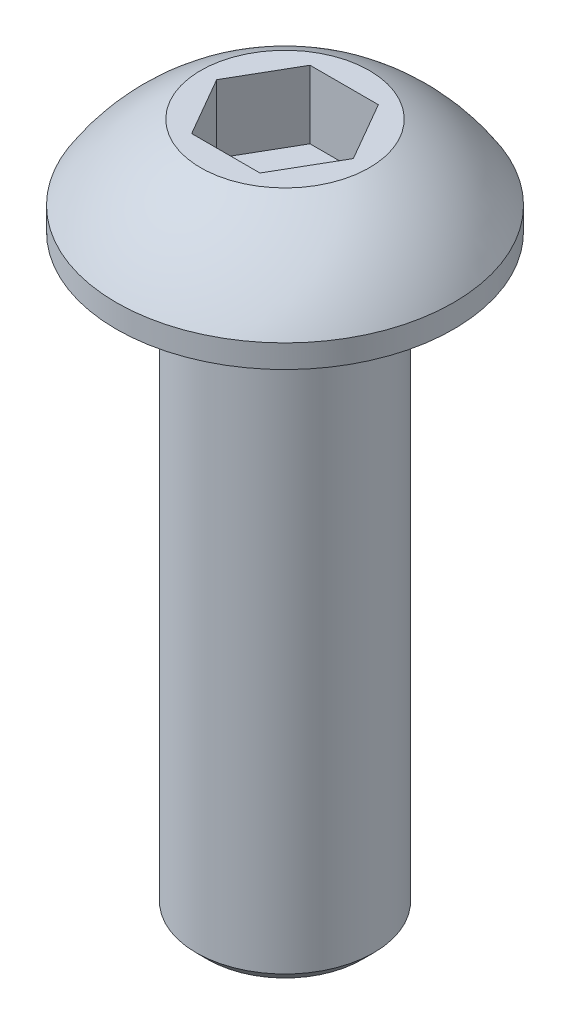
ISO-10303-21;
HEADER;
FILE_DESCRIPTION(('STEP AP214'),'2;1');
FILE_NAME('part.step','',(''),(''),'','','');
FILE_SCHEMA(('AUTOMOTIVE_DESIGN { 1 0 10303 214 1 1 1 1 }'));
ENDSEC;
DATA;
#1=APPLICATION_CONTEXT('core data for automotive mechanical design processes');
#2=APPLICATION_PROTOCOL_DEFINITION('international standard','automotive_design',2000,#1);
#3=PRODUCT_CONTEXT('',#1,'mechanical');
#4=PRODUCT('Part','Part','',(#3));
#5=PRODUCT_RELATED_PRODUCT_CATEGORY('part','',(#4));
#6=PRODUCT_DEFINITION_FORMATION('','',#4);
#7=PRODUCT_DEFINITION_CONTEXT('part definition',#1,'design');
#8=PRODUCT_DEFINITION('design','',#6,#7);
#9=PRODUCT_DEFINITION_SHAPE('','',#8);
#10=(LENGTH_UNIT() NAMED_UNIT(*) SI_UNIT(.MILLI.,.METRE.));
#11=(NAMED_UNIT(*) PLANE_ANGLE_UNIT() SI_UNIT($,.RADIAN.));
#12=(NAMED_UNIT(*) SI_UNIT($,.STERADIAN.) SOLID_ANGLE_UNIT());
#13=UNCERTAINTY_MEASURE_WITH_UNIT(LENGTH_MEASURE(1.E-05),#10,'distance_accuracy_value','');
#14=(GEOMETRIC_REPRESENTATION_CONTEXT(3) GLOBAL_UNCERTAINTY_ASSIGNED_CONTEXT((#13)) GLOBAL_UNIT_ASSIGNED_CONTEXT((#10,
#11,#12)) REPRESENTATION_CONTEXT('',''));
#15=CARTESIAN_POINT('',(0.,0.,0.));
#16=DIRECTION('',(0.,0.,1.));
#17=DIRECTION('',(1.,0.,0.));
#18=AXIS2_PLACEMENT_3D('',#15,#16,#17);
#19=CARTESIAN_POINT('',(0.,1.65,0.));
#20=DIRECTION('',(0.,-1.,0.));
#21=DIRECTION('',(0.,0.,-1.));
#22=AXIS2_PLACEMENT_3D('',#19,#20,#21);
#23=PLANE('',#22);
#24=DIRECTION('',(0.5,0.,-0.866025403784439));
#25=VECTOR('',#24,1.);
#26=CARTESIAN_POINT('',(0.577350269189626,1.65,1.));
#27=LINE('',#26,#25);
#28=CARTESIAN_POINT('',(0.577350269189626,1.65,1.));
#29=VERTEX_POINT('',#28);
#30=CARTESIAN_POINT('',(1.15470053837925,1.65,0.));
#31=VERTEX_POINT('',#30);
#32=EDGE_CURVE('E122',#29,#31,#27,.T.);
#33=ORIENTED_EDGE('',*,*,#32,.F.);
#34=DIRECTION('',(1.,0.,0.));
#35=VECTOR('',#34,1.);
#36=CARTESIAN_POINT('',(-0.577350269189626,1.65,1.));
#37=LINE('',#36,#35);
#38=CARTESIAN_POINT('',(-0.577350269189626,1.65,1.));
#39=VERTEX_POINT('',#38);
#40=EDGE_CURVE('E48',#39,#29,#37,.T.);
#41=ORIENTED_EDGE('',*,*,#40,.F.);
#42=DIRECTION('',(0.5,0.,0.866025403784439));
#43=VECTOR('',#42,1.);
#44=CARTESIAN_POINT('',(-1.15470053837925,1.65,0.));
#45=LINE('',#44,#43);
#46=CARTESIAN_POINT('',(-1.15470053837925,1.65,0.));
#47=VERTEX_POINT('',#46);
#48=EDGE_CURVE('E131',#47,#39,#45,.T.);
#49=ORIENTED_EDGE('',*,*,#48,.F.);
#50=DIRECTION('',(-0.5,0.,0.866025403784438));
#51=VECTOR('',#50,1.);
#52=CARTESIAN_POINT('',(-0.577350269189626,1.65,-1.));
#53=LINE('',#52,#51);
#54=CARTESIAN_POINT('',(-0.577350269189626,1.65,-1.));
#55=VERTEX_POINT('',#54);
#56=EDGE_CURVE('E129',#55,#47,#53,.T.);
#57=ORIENTED_EDGE('',*,*,#56,.F.);
#58=DIRECTION('',(-1.,0.,0.));
#59=VECTOR('',#58,1.);
#60=CARTESIAN_POINT('',(0.577350269189625,1.65,-1.));
#61=LINE('',#60,#59);
#62=CARTESIAN_POINT('',(0.577350269189625,1.65,-1.));
#63=VERTEX_POINT('',#62);
#64=EDGE_CURVE('E96',#63,#55,#61,.T.);
#65=ORIENTED_EDGE('',*,*,#64,.F.);
#66=DIRECTION('',(-0.5,0.,-0.866025403784439));
#67=VECTOR('',#66,1.);
#68=CARTESIAN_POINT('',(1.15470053837925,1.65,0.));
#69=LINE('',#68,#67);
#70=EDGE_CURVE('E125',#31,#63,#69,.T.);
#71=ORIENTED_EDGE('',*,*,#70,.F.);
#72=EDGE_LOOP('',(#33,#41,#49,#57,#65,#71));
#73=FACE_BOUND('',#72,.T.);
#74=CARTESIAN_POINT('',(0.,1.65,0.));
#75=DIRECTION('',(0.,1.,0.));
#76=DIRECTION('',(0.,0.,1.));
#77=AXIS2_PLACEMENT_3D('',#74,#75,#76);
#78=CIRCLE('',#77,1.425);
#79=CARTESIAN_POINT('',(0.,1.65,-1.425));
#80=VERTEX_POINT('',#79);
#81=EDGE_CURVE('E11',#80,#80,#78,.T.);
#82=ORIENTED_EDGE('',*,*,#81,.T.);
#83=EDGE_LOOP('',(#82));
#84=FACE_BOUND('',#83,.T.);
#85=ADVANCED_FACE('F34',(#73,#84),#23,.F.);
#86=CARTESIAN_POINT('',(0.,-1.39741071428571,0.));
#87=DIRECTION('',(0.,1.,0.));
#88=DIRECTION('',(0.,0.,-1.));
#89=AXIS2_PLACEMENT_3D('',#86,#87,#88);
#90=SPHERICAL_SURFACE('',#89,3.36412500682471);
#91=CARTESIAN_POINT('',(0.,0.39,0.));
#92=DIRECTION('',(0.,1.,0.));
#93=DIRECTION('',(0.,0.,1.));
#94=AXIS2_PLACEMENT_3D('',#91,#92,#93);
#95=CIRCLE('',#94,2.85);
#96=CARTESIAN_POINT('',(0.,0.39,-2.85));
#97=VERTEX_POINT('',#96);
#98=EDGE_CURVE('E41',#97,#97,#95,.T.);
#99=CARTESIAN_POINT('',(0.,1.65,-1.425));
#100=CARTESIAN_POINT('',(0.,1.64149095049913,-1.44319693920159));
#101=CARTESIAN_POINT('',(0.,1.63281887604925,-1.46131764558181));
#102=CARTESIAN_POINT('',(0.,1.61515154188376,-1.49740081787377));
#103=CARTESIAN_POINT('',(0.,1.60615628216816,-1.51536328378551));
#104=CARTESIAN_POINT('',(0.,1.58784544210356,-1.55112420031471));
#105=CARTESIAN_POINT('',(0.,1.57852986175455,-1.56892265093218));
#106=CARTESIAN_POINT('',(0.,1.55958137563401,-1.6043498282852));
#107=CARTESIAN_POINT('',(0.,1.54994846986247,-1.62197855502074));
#108=CARTESIAN_POINT('',(0.,1.53036842249044,-1.65706062684029));
#109=CARTESIAN_POINT('',(0.,1.52042128088994,-1.6745139719243));
#110=CARTESIAN_POINT('',(0.,1.50021595428592,-1.70923967992745));
#111=CARTESIAN_POINT('',(0.,1.48995776928239,-1.72651204284659));
#112=CARTESIAN_POINT('',(0.,1.46913364757643,-1.76087024382148));
#113=CARTESIAN_POINT('',(0.,1.45856771087399,-1.77795608187723));
#114=CARTESIAN_POINT('',(0.,1.43713147637405,-1.81193575035214));
#115=CARTESIAN_POINT('',(0.,1.42626117857655,-1.8288295807713));
#116=CARTESIAN_POINT('',(0.,1.40421971012039,-1.86241981279568));
#117=CARTESIAN_POINT('',(0.,1.39304853946175,-1.87911621440089));
#118=CARTESIAN_POINT('',(0.,1.37040891007659,-1.91230623097925));
#119=CARTESIAN_POINT('',(0.,1.35894045135009,-1.92879984595241));
#120=CARTESIAN_POINT('',(0.,1.33570992601851,-1.96157899652078));
#121=CARTESIAN_POINT('',(0.,1.32394785941343,-1.97786453211599));
#122=CARTESIAN_POINT('',(0.,1.3001338927325,-2.0102222979549));
#123=CARTESIAN_POINT('',(0.,1.28808199265664,-2.0262945281986));
#124=CARTESIAN_POINT('',(0.,1.26369222644834,-2.05822052580979));
#125=CARTESIAN_POINT('',(0.,1.2513543603159,-2.07407429317729));
#126=CARTESIAN_POINT('',(0.,1.2263966211742,-2.10555827761544));
#127=CARTESIAN_POINT('',(0.,1.21377674816496,-2.12118849468608));
#128=CARTESIAN_POINT('',(0.,1.18825904494449,-2.15222036284638));
#129=CARTESIAN_POINT('',(0.,1.17536121473327,-2.16762201393603));
#130=CARTESIAN_POINT('',(0.,1.14929173597923,-2.19819180779629));
#131=CARTESIAN_POINT('',(0.,1.1361200874364,-2.21335995056689));
#132=CARTESIAN_POINT('',(0.,1.1095071987569,-2.24345786038299));
#133=CARTESIAN_POINT('',(0.,1.09606595862022,-2.25838762742849));
#134=CARTESIAN_POINT('',(0.,1.06891820000179,-2.28800399488234));
#135=CARTESIAN_POINT('',(0.,1.05521168152004,-2.30269059529069));
#136=CARTESIAN_POINT('',(0.,1.02753776458719,-2.33181591658951));
#137=CARTESIAN_POINT('',(0.,1.01357036613608,-2.34625463747998));
#138=CARTESIAN_POINT('',(0.,0.985379171355736,-2.37487956640605));
#139=CARTESIAN_POINT('',(0.,0.971155375026495,-2.38906577444164));
#140=CARTESIAN_POINT('',(0.,0.942455948858309,-2.41718112535147));
#141=CARTESIAN_POINT('',(0.,0.927980319019364,-2.4311102682257));
#142=CARTESIAN_POINT('',(0.,0.898781871012759,-2.4587070189977));
#143=CARTESIAN_POINT('',(0.,0.884059052845099,-2.47237462689547));
#144=CARTESIAN_POINT('',(0.,0.854370952683837,-2.49944392182496));
#145=CARTESIAN_POINT('',(0.,0.839405670690235,-2.51284560885668));
#146=CARTESIAN_POINT('',(0.,0.809237445186139,-2.5393787614983));
#147=CARTESIAN_POINT('',(0.,0.794034501675645,-2.55251022710819));
#148=CARTESIAN_POINT('',(0.,0.763395831709919,-2.57849872306094));
#149=CARTESIAN_POINT('',(0.,0.747960105254686,-2.5913557534038));
#150=CARTESIAN_POINT('',(0.,0.71686082267716,-2.61679125305221));
#151=CARTESIAN_POINT('',(0.,0.701197266554865,-2.62936972235777));
#152=CARTESIAN_POINT('',(0.,0.669647351007315,-2.65424406351484));
#153=CARTESIAN_POINT('',(0.,0.653760991582058,-2.66653993536634));
#154=CARTESIAN_POINT('',(0.,0.621770567376661,-2.6908451360167));
#155=CARTESIAN_POINT('',(0.,0.60566650259652,-2.70285446481555));
#156=CARTESIAN_POINT('',(0.,0.573245835165109,-2.72658272521418));
#157=CARTESIAN_POINT('',(0.,0.556929232513839,-2.73830165681396));
#158=CARTESIAN_POINT('',(0.,0.524088726240428,-2.76144536371601));
#159=CARTESIAN_POINT('',(0.,0.507564822618288,-2.77287013901829));
#160=CARTESIAN_POINT('',(0.,0.474315013295553,-2.79542186167715));
#161=CARTESIAN_POINT('',(0.,0.457589107594958,-2.80654880903373));
#162=CARTESIAN_POINT('',(0.,0.423940674735817,-2.82850132563867));
#163=CARTESIAN_POINT('',(0.,0.407018147577271,-2.83932689488702));
#164=CARTESIAN_POINT('',(0.,0.39,-2.85));
#165=B_SPLINE_CURVE_WITH_KNOTS('',3,(#99,#100,#101,#102,#103,#104,#105,#106,#107,#108,#109,#110,
#111,#112,#113,#114,#115,#116,#117,#118,#119,#120,#121,#122,#123,#124,#125,#126,#127,#128,#129,
#130,#131,#132,#133,#134,#135,#136,#137,#138,#139,#140,#141,#142,#143,#144,#145,#146,#147,#148,
#149,#150,#151,#152,#153,#154,#155,#156,#157,#158,#159,#160,#161,#162,#163,#164),.UNSPECIFIED.,
.F.,.F.,(4,2,2,2,2,2,2,2,2,2,2,2,2,2,2,2,2,2,2,2,2,2,2,2,2,2,2,2,2,2,2,2,4),(0.,
0.0602635497340825,0.120527099468164,0.180790649202247,0.24105419893633,0.301317748670412,
0.361581298404494,0.421844848138577,0.482108397872659,0.542371947606741,0.602635497340824,
0.662899047074906,0.723162596808989,0.783426146543071,0.843689696277154,0.903953246011236,
0.964216795745318,1.0244803454794,1.08474389521348,1.14500744494757,1.20527099468165,
1.26553454441573,1.32579809414981,1.3860616438839,1.44632519361798,1.50658874335206,
1.56685229308614,1.62711584282022,1.68737939255431,1.74764294228839,1.80790649202247,
1.86817004175655,1.92843359149064),.UNSPECIFIED.);
#166=EDGE_CURVE('BSEAM157',#80,#97,#165,.T.);
#167=ORIENTED_EDGE('',*,*,#81,.F.);
#168=ORIENTED_EDGE('',*,*,#98,.T.);
#169=ORIENTED_EDGE('',*,*,#166,.T.);
#170=ORIENTED_EDGE('',*,*,#166,.F.);
#171=EDGE_LOOP('',(#167,#169,#168,#170));
#172=FACE_BOUND('',#171,.T.);
#173=ADVANCED_FACE('F157',(#172),#90,.T.);
#174=CARTESIAN_POINT('',(0.,10.4570624946846,0.));
#175=DIRECTION('',(0.,1.,0.));
#176=DIRECTION('',(0.,0.,1.));
#177=AXIS2_PLACEMENT_3D('',#174,#175,#176);
#178=CYLINDRICAL_SURFACE('',#177,2.85);
#179=ORIENTED_EDGE('',*,*,#98,.F.);
#180=EDGE_LOOP('',(#179));
#181=FACE_BOUND('',#180,.T.);
#182=CARTESIAN_POINT('',(0.,0.,0.));
#183=DIRECTION('',(0.,1.,0.));
#184=DIRECTION('',(0.,0.,1.));
#185=AXIS2_PLACEMENT_3D('',#182,#183,#184);
#186=CIRCLE('',#185,2.85);
#187=CARTESIAN_POINT('',(0.,0.,2.85));
#188=VERTEX_POINT('',#187);
#189=EDGE_CURVE('E152',#188,#188,#186,.T.);
#190=ORIENTED_EDGE('',*,*,#189,.T.);
#191=EDGE_LOOP('',(#190));
#192=FACE_BOUND('',#191,.T.);
#193=ADVANCED_FACE('F159',(#181,#192),#178,.T.);
#194=CARTESIAN_POINT('',(0.,0.,-1.7));
#195=DIRECTION('',(0.,1.,0.));
#196=DIRECTION('',(0.,0.,1.));
#197=AXIS2_PLACEMENT_3D('',#194,#195,#196);
#198=PLANE('',#197);
#199=ORIENTED_EDGE('',*,*,#189,.F.);
#200=EDGE_LOOP('',(#199));
#201=FACE_BOUND('',#200,.T.);
#202=CARTESIAN_POINT('',(0.,0.,0.));
#203=DIRECTION('',(0.,1.,0.));
#204=DIRECTION('',(0.,0.,1.));
#205=AXIS2_PLACEMENT_3D('',#202,#203,#204);
#206=CIRCLE('',#205,1.7);
#207=CARTESIAN_POINT('',(0.,0.,1.7));
#208=VERTEX_POINT('',#207);
#209=EDGE_CURVE('E149',#208,#208,#206,.T.);
#210=ORIENTED_EDGE('',*,*,#209,.T.);
#211=EDGE_LOOP('',(#210));
#212=FACE_BOUND('',#211,.T.);
#213=ADVANCED_FACE('F162',(#201,#212),#198,.F.);
#214=CARTESIAN_POINT('',(0.,-0.2,0.));
#215=DIRECTION('',(0.,1.,0.));
#216=DIRECTION('',(0.,0.,1.));
#217=AXIS2_PLACEMENT_3D('',#214,#215,#216);
#218=TOROIDAL_SURFACE('',#217,1.7,0.2);
#219=ORIENTED_EDGE('',*,*,#209,.F.);
#220=EDGE_LOOP('',(#219));
#221=FACE_BOUND('',#220,.T.);
#222=CARTESIAN_POINT('',(0.,-0.200000000000002,0.));
#223=DIRECTION('',(0.,1.,0.));
#224=DIRECTION('',(0.,0.,1.));
#225=AXIS2_PLACEMENT_3D('',#222,#223,#224);
#226=CIRCLE('',#225,1.5);
#227=CARTESIAN_POINT('',(0.,-0.200000000000002,1.5));
#228=VERTEX_POINT('',#227);
#229=EDGE_CURVE('E146',#228,#228,#226,.T.);
#230=ORIENTED_EDGE('',*,*,#229,.T.);
#231=EDGE_LOOP('',(#230));
#232=FACE_BOUND('',#231,.T.);
#233=ADVANCED_FACE('F168',(#221,#232),#218,.F.);
#234=CARTESIAN_POINT('',(0.,10.4570624946846,0.));
#235=DIRECTION('',(0.,1.,0.));
#236=DIRECTION('',(0.,0.,1.));
#237=AXIS2_PLACEMENT_3D('',#234,#235,#236);
#238=CYLINDRICAL_SURFACE('',#237,1.5);
#239=ORIENTED_EDGE('',*,*,#229,.F.);
#240=EDGE_LOOP('',(#239));
#241=FACE_BOUND('',#240,.T.);
#242=CARTESIAN_POINT('',(0.,-9.8,0.));
#243=DIRECTION('',(0.,1.,0.));
#244=DIRECTION('',(0.,0.,1.));
#245=AXIS2_PLACEMENT_3D('',#242,#243,#244);
#246=CIRCLE('',#245,1.5);
#247=CARTESIAN_POINT('',(0.,-9.8,1.5));
#248=VERTEX_POINT('',#247);
#249=EDGE_CURVE('E143',#248,#248,#246,.T.);
#250=ORIENTED_EDGE('',*,*,#249,.T.);
#251=EDGE_LOOP('',(#250));
#252=FACE_BOUND('',#251,.T.);
#253=ADVANCED_FACE('F174',(#241,#252),#238,.T.);
#254=CARTESIAN_POINT('',(0.,-10.,0.));
#255=DIRECTION('',(0.,1.,0.));
#256=DIRECTION('',(0.,0.,1.));
#257=AXIS2_PLACEMENT_3D('',#254,#255,#256);
#258=CONICAL_SURFACE('',#257,1.3,0.785398163397443);
#259=ORIENTED_EDGE('',*,*,#249,.F.);
#260=EDGE_LOOP('',(#259));
#261=FACE_BOUND('',#260,.T.);
#262=CARTESIAN_POINT('',(0.,-10.,0.));
#263=DIRECTION('',(0.,1.,0.));
#264=DIRECTION('',(0.,0.,1.));
#265=AXIS2_PLACEMENT_3D('',#262,#263,#264);
#266=CIRCLE('',#265,1.3);
#267=CARTESIAN_POINT('',(0.,-10.,1.3));
#268=VERTEX_POINT('',#267);
#269=EDGE_CURVE('E135',#268,#268,#266,.T.);
#270=ORIENTED_EDGE('',*,*,#269,.T.);
#271=EDGE_LOOP('',(#270));
#272=FACE_BOUND('',#271,.T.);
#273=ADVANCED_FACE('F180',(#261,#272),#258,.T.);
#274=CARTESIAN_POINT('',(0.,-10.,0.));
#275=DIRECTION('',(0.,1.,0.));
#276=DIRECTION('',(0.,0.,1.));
#277=AXIS2_PLACEMENT_3D('',#274,#275,#276);
#278=PLANE('',#277);
#279=ORIENTED_EDGE('',*,*,#269,.F.);
#280=EDGE_LOOP('',(#279));
#281=FACE_BOUND('',#280,.T.);
#282=ADVANCED_FACE('F186',(#281),#278,.F.);
#283=CARTESIAN_POINT('',(-0.577350269189626,0.5,1.));
#284=DIRECTION('',(0.,0.,1.));
#285=DIRECTION('',(1.,0.,0.));
#286=AXIS2_PLACEMENT_3D('',#283,#284,#285);
#287=PLANE('',#286);
#288=ORIENTED_EDGE('',*,*,#40,.T.);
#289=DIRECTION('',(0.,1.,0.));
#290=VECTOR('',#289,1.);
#291=CARTESIAN_POINT('',(0.577350269189626,0.5,1.));
#292=LINE('',#291,#290);
#293=CARTESIAN_POINT('',(0.577350269189626,0.5,1.));
#294=VERTEX_POINT('',#293);
#295=EDGE_CURVE('E78',#294,#29,#292,.T.);
#296=ORIENTED_EDGE('',*,*,#295,.F.);
#297=DIRECTION('',(1.,0.,0.));
#298=VECTOR('',#297,1.);
#299=CARTESIAN_POINT('',(-0.577350269189626,0.5,1.));
#300=LINE('',#299,#298);
#301=CARTESIAN_POINT('',(-0.577350269189626,0.5,1.));
#302=VERTEX_POINT('',#301);
#303=EDGE_CURVE('E133',#302,#294,#300,.T.);
#304=ORIENTED_EDGE('',*,*,#303,.F.);
#305=DIRECTION('',(0.,1.,0.));
#306=VECTOR('',#305,1.);
#307=CARTESIAN_POINT('',(-0.577350269189626,0.5,1.));
#308=LINE('',#307,#306);
#309=EDGE_CURVE('E56',#302,#39,#308,.T.);
#310=ORIENTED_EDGE('',*,*,#309,.T.);
#311=EDGE_LOOP('',(#288,#296,#304,#310));
#312=FACE_BOUND('',#311,.T.);
#313=ADVANCED_FACE('F191',(#312),#287,.F.);
#314=CARTESIAN_POINT('',(-1.15470053837925,0.5,0.));
#315=DIRECTION('',(-0.866025403784439,0.,0.5));
#316=DIRECTION('',(0.5,0.,0.866025403784439));
#317=AXIS2_PLACEMENT_3D('',#314,#315,#316);
#318=PLANE('',#317);
#319=ORIENTED_EDGE('',*,*,#48,.T.);
#320=ORIENTED_EDGE('',*,*,#309,.F.);
#321=DIRECTION('',(0.5,0.,0.866025403784439));
#322=VECTOR('',#321,1.);
#323=CARTESIAN_POINT('',(-1.15470053837925,0.5,0.));
#324=LINE('',#323,#322);
#325=CARTESIAN_POINT('',(-1.15470053837925,0.5,0.));
#326=VERTEX_POINT('',#325);
#327=EDGE_CURVE('E108',#326,#302,#324,.T.);
#328=ORIENTED_EDGE('',*,*,#327,.F.);
#329=DIRECTION('',(0.,1.,0.));
#330=VECTOR('',#329,1.);
#331=CARTESIAN_POINT('',(-1.15470053837925,0.5,0.));
#332=LINE('',#331,#330);
#333=EDGE_CURVE('E100',#326,#47,#332,.T.);
#334=ORIENTED_EDGE('',*,*,#333,.T.);
#335=EDGE_LOOP('',(#319,#320,#328,#334));
#336=FACE_BOUND('',#335,.T.);
#337=ADVANCED_FACE('F196',(#336),#318,.F.);
#338=CARTESIAN_POINT('',(-0.577350269189626,0.5,-1.));
#339=DIRECTION('',(-0.866025403784438,0.,-0.5));
#340=DIRECTION('',(-0.5,0.,0.866025403784438));
#341=AXIS2_PLACEMENT_3D('',#338,#339,#340);
#342=PLANE('',#341);
#343=ORIENTED_EDGE('',*,*,#56,.T.);
#344=ORIENTED_EDGE('',*,*,#333,.F.);
#345=DIRECTION('',(-0.5,0.,0.866025403784438));
#346=VECTOR('',#345,1.);
#347=CARTESIAN_POINT('',(-0.577350269189626,0.5,-1.));
#348=LINE('',#347,#346);
#349=CARTESIAN_POINT('',(-0.577350269189626,0.5,-1.));
#350=VERTEX_POINT('',#349);
#351=EDGE_CURVE('E104',#350,#326,#348,.T.);
#352=ORIENTED_EDGE('',*,*,#351,.F.);
#353=DIRECTION('',(0.,1.,0.));
#354=VECTOR('',#353,1.);
#355=CARTESIAN_POINT('',(-0.577350269189626,0.5,-1.));
#356=LINE('',#355,#354);
#357=EDGE_CURVE('E89',#350,#55,#356,.T.);
#358=ORIENTED_EDGE('',*,*,#357,.T.);
#359=EDGE_LOOP('',(#343,#344,#352,#358));
#360=FACE_BOUND('',#359,.T.);
#361=ADVANCED_FACE('F105',(#360),#342,.F.);
#362=CARTESIAN_POINT('',(0.577350269189625,0.5,-1.));
#363=DIRECTION('',(0.,0.,-1.));
#364=DIRECTION('',(-1.,0.,0.));
#365=AXIS2_PLACEMENT_3D('',#362,#363,#364);
#366=PLANE('',#365);
#367=ORIENTED_EDGE('',*,*,#64,.T.);
#368=ORIENTED_EDGE('',*,*,#357,.F.);
#369=DIRECTION('',(-1.,0.,0.));
#370=VECTOR('',#369,1.);
#371=CARTESIAN_POINT('',(0.577350269189625,0.5,-1.));
#372=LINE('',#371,#370);
#373=CARTESIAN_POINT('',(0.577350269189625,0.5,-1.));
#374=VERTEX_POINT('',#373);
#375=EDGE_CURVE('E93',#374,#350,#372,.T.);
#376=ORIENTED_EDGE('',*,*,#375,.F.);
#377=DIRECTION('',(0.,1.,0.));
#378=VECTOR('',#377,1.);
#379=CARTESIAN_POINT('',(0.577350269189625,0.5,-1.));
#380=LINE('',#379,#378);
#381=EDGE_CURVE('E101',#374,#63,#380,.T.);
#382=ORIENTED_EDGE('',*,*,#381,.T.);
#383=EDGE_LOOP('',(#367,#368,#376,#382));
#384=FACE_BOUND('',#383,.T.);
#385=ADVANCED_FACE('F91',(#384),#366,.F.);
#386=CARTESIAN_POINT('',(1.15470053837925,0.5,0.));
#387=DIRECTION('',(0.866025403784439,0.,-0.5));
#388=DIRECTION('',(-0.5,0.,-0.866025403784439));
#389=AXIS2_PLACEMENT_3D('',#386,#387,#388);
#390=PLANE('',#389);
#391=ORIENTED_EDGE('',*,*,#70,.T.);
#392=ORIENTED_EDGE('',*,*,#381,.F.);
#393=DIRECTION('',(-0.5,0.,-0.866025403784439));
#394=VECTOR('',#393,1.);
#395=CARTESIAN_POINT('',(1.15470053837925,0.5,0.));
#396=LINE('',#395,#394);
#397=CARTESIAN_POINT('',(1.15470053837925,0.5,0.));
#398=VERTEX_POINT('',#397);
#399=EDGE_CURVE('E114',#398,#374,#396,.T.);
#400=ORIENTED_EDGE('',*,*,#399,.F.);
#401=DIRECTION('',(0.,1.,0.));
#402=VECTOR('',#401,1.);
#403=CARTESIAN_POINT('',(1.15470053837925,0.5,0.));
#404=LINE('',#403,#402);
#405=EDGE_CURVE('E138',#398,#31,#404,.T.);
#406=ORIENTED_EDGE('',*,*,#405,.T.);
#407=EDGE_LOOP('',(#391,#392,#400,#406));
#408=FACE_BOUND('',#407,.T.);
#409=ADVANCED_FACE('F222',(#408),#390,.F.);
#410=CARTESIAN_POINT('',(0.577350269189626,0.5,1.));
#411=DIRECTION('',(0.866025403784438,0.,0.5));
#412=DIRECTION('',(0.5,0.,-0.866025403784439));
#413=AXIS2_PLACEMENT_3D('',#410,#411,#412);
#414=PLANE('',#413);
#415=ORIENTED_EDGE('',*,*,#32,.T.);
#416=ORIENTED_EDGE('',*,*,#405,.F.);
#417=DIRECTION('',(0.5,0.,-0.866025403784439));
#418=VECTOR('',#417,1.);
#419=CARTESIAN_POINT('',(0.577350269189626,0.5,1.));
#420=LINE('',#419,#418);
#421=EDGE_CURVE('E116',#294,#398,#420,.T.);
#422=ORIENTED_EDGE('',*,*,#421,.F.);
#423=ORIENTED_EDGE('',*,*,#295,.T.);
#424=EDGE_LOOP('',(#415,#416,#422,#423));
#425=FACE_BOUND('',#424,.T.);
#426=ADVANCED_FACE('F210',(#425),#414,.F.);
#427=CARTESIAN_POINT('',(0.,0.5,0.));
#428=DIRECTION('',(0.,1.,0.));
#429=DIRECTION('',(0.,0.,1.));
#430=AXIS2_PLACEMENT_3D('',#427,#428,#429);
#431=PLANE('',#430);
#432=ORIENTED_EDGE('',*,*,#303,.T.);
#433=ORIENTED_EDGE('',*,*,#421,.T.);
#434=ORIENTED_EDGE('',*,*,#399,.T.);
#435=ORIENTED_EDGE('',*,*,#375,.T.);
#436=ORIENTED_EDGE('',*,*,#351,.T.);
#437=ORIENTED_EDGE('',*,*,#327,.T.);
#438=EDGE_LOOP('',(#432,#433,#434,#435,#436,#437));
#439=FACE_BOUND('',#438,.T.);
#440=ADVANCED_FACE('F111',(#439),#431,.T.);
#441=CLOSED_SHELL('',(#85,#173,#193,#213,#233,#253,#273,#282,#313,#337,#361,#385,#409,#426,#440));
#442=MANIFOLD_SOLID_BREP('B2',#441);
#443=ADVANCED_BREP_SHAPE_REPRESENTATION('',(#18,#442),#14);
#444=SHAPE_DEFINITION_REPRESENTATION(#9,#443);
ENDSEC;
END-ISO-10303-21;
